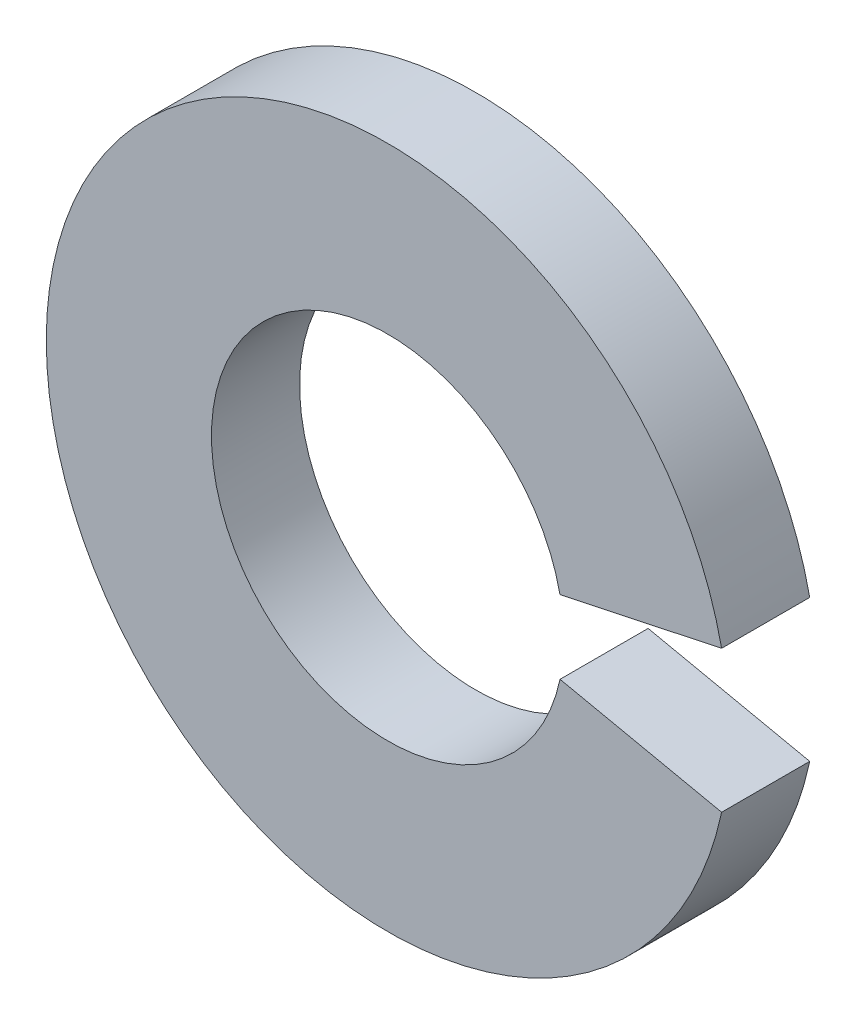
ISO-10303-21;
HEADER;
FILE_DESCRIPTION(('STEP AP214'),'2;1');
FILE_NAME('part.step','',(''),(''),'','','');
FILE_SCHEMA(('AUTOMOTIVE_DESIGN { 1 0 10303 214 1 1 1 1 }'));
ENDSEC;
DATA;
#1=APPLICATION_CONTEXT('core data for automotive mechanical design processes');
#2=APPLICATION_PROTOCOL_DEFINITION('international standard','automotive_design',2000,#1);
#3=PRODUCT_CONTEXT('',#1,'mechanical');
#4=PRODUCT('Part','Part','',(#3));
#5=PRODUCT_RELATED_PRODUCT_CATEGORY('part','',(#4));
#6=PRODUCT_DEFINITION_FORMATION('','',#4);
#7=PRODUCT_DEFINITION_CONTEXT('part definition',#1,'design');
#8=PRODUCT_DEFINITION('design','',#6,#7);
#9=PRODUCT_DEFINITION_SHAPE('','',#8);
#10=(LENGTH_UNIT() NAMED_UNIT(*) SI_UNIT(.MILLI.,.METRE.));
#11=(NAMED_UNIT(*) PLANE_ANGLE_UNIT() SI_UNIT($,.RADIAN.));
#12=(NAMED_UNIT(*) SI_UNIT($,.STERADIAN.) SOLID_ANGLE_UNIT());
#13=UNCERTAINTY_MEASURE_WITH_UNIT(LENGTH_MEASURE(1.E-05),#10,'distance_accuracy_value','');
#14=(GEOMETRIC_REPRESENTATION_CONTEXT(3) GLOBAL_UNCERTAINTY_ASSIGNED_CONTEXT((#13)) GLOBAL_UNIT_ASSIGNED_CONTEXT((#10,
#11,#12)) REPRESENTATION_CONTEXT('',''));
#15=CARTESIAN_POINT('',(0.,0.,0.));
#16=DIRECTION('',(0.,0.,1.));
#17=DIRECTION('',(1.,0.,0.));
#18=AXIS2_PLACEMENT_3D('',#15,#16,#17);
#19=CARTESIAN_POINT('',(0.,0.,0.4));
#20=DIRECTION('',(0.,0.,-1.));
#21=DIRECTION('',(-1.,0.,0.));
#22=AXIS2_PLACEMENT_3D('',#19,#20,#21);
#23=CYLINDRICAL_SURFACE('',#22,3.1);
#24=CARTESIAN_POINT('',(0.,0.,-0.4));
#25=DIRECTION('',(0.,0.,1.));
#26=DIRECTION('',(1.,0.,0.));
#27=AXIS2_PLACEMENT_3D('',#24,#25,#26);
#28=CIRCLE('',#27,3.1);
#29=CARTESIAN_POINT('',(3.0322575622748,0.644526241535054,-0.4));
#30=VERTEX_POINT('',#29);
#31=CARTESIAN_POINT('',(3.0322575622748,-0.644526241535054,-0.4));
#32=VERTEX_POINT('',#31);
#33=EDGE_CURVE('E112',#30,#32,#28,.T.);
#34=ORIENTED_EDGE('',*,*,#33,.T.);
#35=DIRECTION('',(0.,0.,-1.));
#36=VECTOR('',#35,1.);
#37=CARTESIAN_POINT('',(3.0322575622748,-0.644526241535054,0.4));
#38=LINE('',#37,#36);
#39=CARTESIAN_POINT('',(3.0322575622748,-0.644526241535054,0.4));
#40=VERTEX_POINT('',#39);
#41=EDGE_CURVE('E11',#40,#32,#38,.T.);
#42=ORIENTED_EDGE('',*,*,#41,.F.);
#43=CARTESIAN_POINT('',(0.,0.,0.4));
#44=DIRECTION('',(0.,0.,1.));
#45=DIRECTION('',(1.,0.,0.));
#46=AXIS2_PLACEMENT_3D('',#43,#44,#45);
#47=CIRCLE('',#46,3.1);
#48=CARTESIAN_POINT('',(3.0322575622748,0.644526241535054,0.4));
#49=VERTEX_POINT('',#48);
#50=EDGE_CURVE('E97',#49,#40,#47,.T.);
#51=ORIENTED_EDGE('',*,*,#50,.F.);
#52=DIRECTION('',(0.,0.,-1.));
#53=VECTOR('',#52,1.);
#54=CARTESIAN_POINT('',(3.0322575622748,0.644526241535054,0.4));
#55=LINE('',#54,#53);
#56=EDGE_CURVE('E110',#49,#30,#55,.T.);
#57=ORIENTED_EDGE('',*,*,#56,.T.);
#58=EDGE_LOOP('',(#34,#42,#51,#57));
#59=FACE_BOUND('',#58,.T.);
#60=ADVANCED_FACE('F50',(#59),#23,.T.);
#61=CARTESIAN_POINT('',(3.0322575622748,-0.644526241535054,0.4));
#62=DIRECTION('',(-0.207911690817759,-0.978147600733805,0.));
#63=DIRECTION('',(0.978147600733806,-0.207911690817759,0.));
#64=AXIS2_PLACEMENT_3D('',#61,#62,#63);
#65=PLANE('',#64);
#66=DIRECTION('',(-0.978147600733805,0.207911690817759,0.));
#67=VECTOR('',#66,1.);
#68=CARTESIAN_POINT('',(3.0322575622748,-0.644526241535054,-0.4));
#69=LINE('',#68,#67);
#70=CARTESIAN_POINT('',(1.56503616117409,-0.332658705308415,-0.4));
#71=VERTEX_POINT('',#70);
#72=EDGE_CURVE('E103',#32,#71,#69,.T.);
#73=ORIENTED_EDGE('',*,*,#72,.T.);
#74=DIRECTION('',(0.,0.,-1.));
#75=VECTOR('',#74,1.);
#76=CARTESIAN_POINT('',(1.56503616117409,-0.332658705308415,0.4));
#77=LINE('',#76,#75);
#78=CARTESIAN_POINT('',(1.56503616117409,-0.332658705308415,0.4));
#79=VERTEX_POINT('',#78);
#80=EDGE_CURVE('E57',#79,#71,#77,.T.);
#81=ORIENTED_EDGE('',*,*,#80,.F.);
#82=DIRECTION('',(-0.978147600733805,0.207911690817759,0.));
#83=VECTOR('',#82,1.);
#84=CARTESIAN_POINT('',(3.0322575622748,-0.644526241535054,0.4));
#85=LINE('',#84,#83);
#86=EDGE_CURVE('E94',#40,#79,#85,.T.);
#87=ORIENTED_EDGE('',*,*,#86,.F.);
#88=ORIENTED_EDGE('',*,*,#41,.T.);
#89=EDGE_LOOP('',(#73,#81,#87,#88));
#90=FACE_BOUND('',#89,.T.);
#91=ADVANCED_FACE('F105',(#90),#65,.F.);
#92=CARTESIAN_POINT('',(0.,0.,0.4));
#93=DIRECTION('',(0.,0.,-1.));
#94=DIRECTION('',(-1.,0.,0.));
#95=AXIS2_PLACEMENT_3D('',#92,#93,#94);
#96=CYLINDRICAL_SURFACE('',#95,1.6);
#97=CARTESIAN_POINT('',(0.,0.,-0.4));
#98=DIRECTION('',(0.,0.,-1.));
#99=DIRECTION('',(-1.,0.,0.));
#100=AXIS2_PLACEMENT_3D('',#97,#98,#99);
#101=CIRCLE('',#100,1.6);
#102=CARTESIAN_POINT('',(1.56503616117409,0.332658705308415,-0.4));
#103=VERTEX_POINT('',#102);
#104=EDGE_CURVE('E82',#71,#103,#101,.T.);
#105=ORIENTED_EDGE('',*,*,#104,.T.);
#106=DIRECTION('',(0.,0.,-1.));
#107=VECTOR('',#106,1.);
#108=CARTESIAN_POINT('',(1.56503616117409,0.332658705308415,0.4));
#109=LINE('',#108,#107);
#110=CARTESIAN_POINT('',(1.56503616117409,0.332658705308415,0.4));
#111=VERTEX_POINT('',#110);
#112=EDGE_CURVE('E102',#111,#103,#109,.T.);
#113=ORIENTED_EDGE('',*,*,#112,.F.);
#114=CARTESIAN_POINT('',(0.,0.,0.4));
#115=DIRECTION('',(0.,0.,-1.));
#116=DIRECTION('',(-1.,0.,0.));
#117=AXIS2_PLACEMENT_3D('',#114,#115,#116);
#118=CIRCLE('',#117,1.6);
#119=EDGE_CURVE('E100',#79,#111,#118,.T.);
#120=ORIENTED_EDGE('',*,*,#119,.F.);
#121=ORIENTED_EDGE('',*,*,#80,.T.);
#122=EDGE_LOOP('',(#105,#113,#120,#121));
#123=FACE_BOUND('',#122,.T.);
#124=ADVANCED_FACE('F104',(#123),#96,.F.);
#125=CARTESIAN_POINT('',(1.56503616117409,0.332658705308415,0.4));
#126=DIRECTION('',(-0.207911690817759,0.978147600733805,0.));
#127=DIRECTION('',(-0.978147600733806,-0.207911690817759,0.));
#128=AXIS2_PLACEMENT_3D('',#125,#126,#127);
#129=PLANE('',#128);
#130=DIRECTION('',(0.978147600733805,0.207911690817759,0.));
#131=VECTOR('',#130,1.);
#132=CARTESIAN_POINT('',(1.56503616117409,0.332658705308415,-0.4));
#133=LINE('',#132,#131);
#134=EDGE_CURVE('E87',#103,#30,#133,.T.);
#135=ORIENTED_EDGE('',*,*,#134,.T.);
#136=ORIENTED_EDGE('',*,*,#56,.F.);
#137=DIRECTION('',(0.978147600733805,0.207911690817759,0.));
#138=VECTOR('',#137,1.);
#139=CARTESIAN_POINT('',(1.56503616117409,0.332658705308415,0.4));
#140=LINE('',#139,#138);
#141=EDGE_CURVE('E63',#111,#49,#140,.T.);
#142=ORIENTED_EDGE('',*,*,#141,.F.);
#143=ORIENTED_EDGE('',*,*,#112,.T.);
#144=EDGE_LOOP('',(#135,#136,#142,#143));
#145=FACE_BOUND('',#144,.T.);
#146=ADVANCED_FACE('F119',(#145),#129,.F.);
#147=CARTESIAN_POINT('',(0.,0.,0.4));
#148=DIRECTION('',(0.,0.,1.));
#149=DIRECTION('',(1.,0.,0.));
#150=AXIS2_PLACEMENT_3D('',#147,#148,#149);
#151=PLANE('',#150);
#152=ORIENTED_EDGE('',*,*,#50,.T.);
#153=ORIENTED_EDGE('',*,*,#86,.T.);
#154=ORIENTED_EDGE('',*,*,#119,.T.);
#155=ORIENTED_EDGE('',*,*,#141,.T.);
#156=EDGE_LOOP('',(#152,#153,#154,#155));
#157=FACE_BOUND('',#156,.T.);
#158=ADVANCED_FACE('F92',(#157),#151,.T.);
#159=CARTESIAN_POINT('',(0.,0.,-0.4));
#160=DIRECTION('',(0.,0.,1.));
#161=DIRECTION('',(1.,0.,0.));
#162=AXIS2_PLACEMENT_3D('',#159,#160,#161);
#163=PLANE('',#162);
#164=ORIENTED_EDGE('',*,*,#33,.F.);
#165=ORIENTED_EDGE('',*,*,#134,.F.);
#166=ORIENTED_EDGE('',*,*,#104,.F.);
#167=ORIENTED_EDGE('',*,*,#72,.F.);
#168=EDGE_LOOP('',(#164,#165,#166,#167));
#169=FACE_BOUND('',#168,.T.);
#170=ADVANCED_FACE('F122',(#169),#163,.F.);
#171=CLOSED_SHELL('',(#60,#91,#124,#146,#158,#170));
#172=MANIFOLD_SOLID_BREP('B2',#171);
#173=ADVANCED_BREP_SHAPE_REPRESENTATION('',(#18,#172),#14);
#174=SHAPE_DEFINITION_REPRESENTATION(#9,#173);
ENDSEC;
END-ISO-10303-21;
